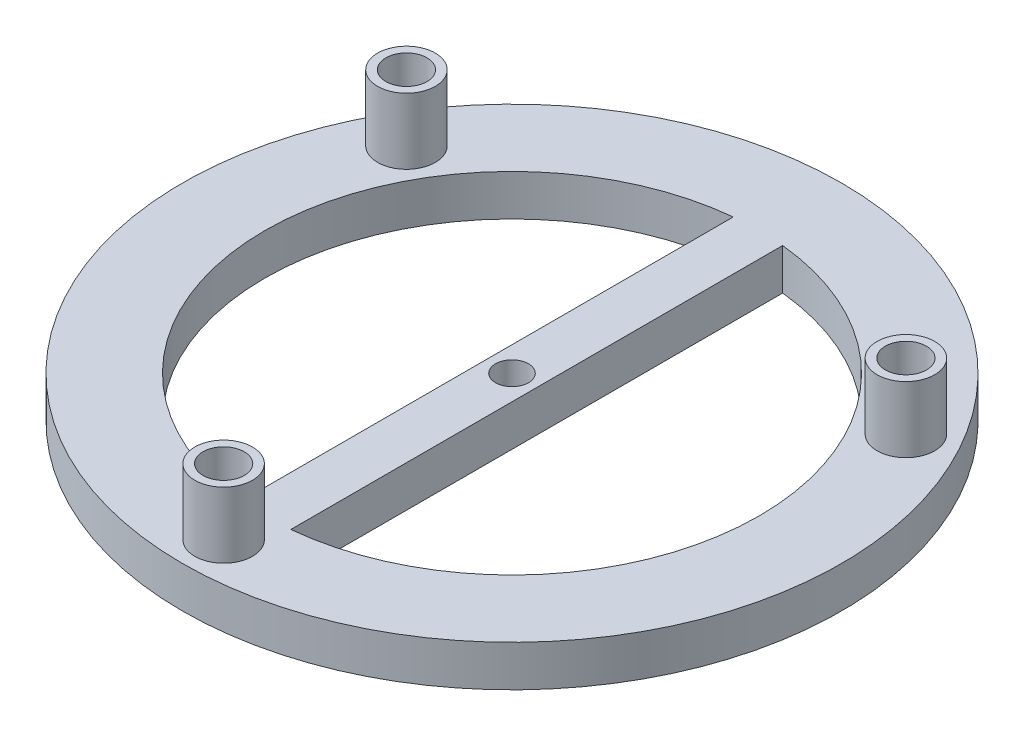
ISO-10303-21;
HEADER;
FILE_DESCRIPTION(('STEP AP214'),'2;1');
FILE_NAME('part.step','',(''),(''),'','','');
FILE_SCHEMA(('AUTOMOTIVE_DESIGN { 1 0 10303 214 1 1 1 1 }'));
ENDSEC;
DATA;
#1=APPLICATION_CONTEXT('core data for automotive mechanical design processes');
#2=APPLICATION_PROTOCOL_DEFINITION('international standard','automotive_design',2000,#1);
#3=PRODUCT_CONTEXT('',#1,'mechanical');
#4=PRODUCT('Part','Part','',(#3));
#5=PRODUCT_RELATED_PRODUCT_CATEGORY('part','',(#4));
#6=PRODUCT_DEFINITION_FORMATION('','',#4);
#7=PRODUCT_DEFINITION_CONTEXT('part definition',#1,'design');
#8=PRODUCT_DEFINITION('design','',#6,#7);
#9=PRODUCT_DEFINITION_SHAPE('','',#8);
#10=(LENGTH_UNIT() NAMED_UNIT(*) SI_UNIT(.MILLI.,.METRE.));
#11=(NAMED_UNIT(*) PLANE_ANGLE_UNIT() SI_UNIT($,.RADIAN.));
#12=(NAMED_UNIT(*) SI_UNIT($,.STERADIAN.) SOLID_ANGLE_UNIT());
#13=UNCERTAINTY_MEASURE_WITH_UNIT(LENGTH_MEASURE(1.E-05),#10,'distance_accuracy_value','');
#14=(GEOMETRIC_REPRESENTATION_CONTEXT(3) GLOBAL_UNCERTAINTY_ASSIGNED_CONTEXT((#13)) GLOBAL_UNIT_ASSIGNED_CONTEXT((#10,
#11,#12)) REPRESENTATION_CONTEXT('',''));
#15=CARTESIAN_POINT('',(0.,0.,0.));
#16=DIRECTION('',(0.,0.,1.));
#17=DIRECTION('',(1.,0.,0.));
#18=AXIS2_PLACEMENT_3D('',#15,#16,#17);
#19=CARTESIAN_POINT('',(0.,5.,0.));
#20=DIRECTION('',(0.,1.,0.));
#21=DIRECTION('',(0.,0.,1.));
#22=AXIS2_PLACEMENT_3D('',#19,#20,#21);
#23=PLANE('',#22);
#24=CARTESIAN_POINT('',(30.3108891324555,5.,-17.4999999999997));
#25=DIRECTION('',(0.,1.,0.));
#26=DIRECTION('',(0.866025403784443,0.,-0.499999999999992));
#27=AXIS2_PLACEMENT_3D('',#24,#25,#26);
#28=CIRCLE('',#27,3.5);
#29=CARTESIAN_POINT('',(33.3419780457011,5.,-19.2499999999997));
#30=VERTEX_POINT('',#29);
#31=EDGE_CURVE('E187',#30,#30,#28,.T.);
#32=ORIENTED_EDGE('',*,*,#31,.F.);
#33=EDGE_LOOP('',(#32));
#34=FACE_BOUND('',#33,.T.);
#35=CARTESIAN_POINT('',(-30.3108891324553,5.,-17.5000000000001));
#36=DIRECTION('',(0.,1.,0.));
#37=DIRECTION('',(-0.866025403784436,0.,-0.500000000000004));
#38=AXIS2_PLACEMENT_3D('',#35,#36,#37);
#39=CIRCLE('',#38,3.5);
#40=CARTESIAN_POINT('',(-33.3419780457008,5.,-19.2500000000002));
#41=VERTEX_POINT('',#40);
#42=EDGE_CURVE('E191',#41,#41,#39,.T.);
#43=ORIENTED_EDGE('',*,*,#42,.F.);
#44=EDGE_LOOP('',(#43));
#45=FACE_BOUND('',#44,.T.);
#46=CARTESIAN_POINT('',(0.,5.,35.));
#47=DIRECTION('',(0.,1.,0.));
#48=DIRECTION('',(0.,0.,1.));
#49=AXIS2_PLACEMENT_3D('',#46,#47,#48);
#50=CIRCLE('',#49,3.5);
#51=CARTESIAN_POINT('',(0.,5.,38.5));
#52=VERTEX_POINT('',#51);
#53=EDGE_CURVE('E195',#52,#52,#50,.T.);
#54=ORIENTED_EDGE('',*,*,#53,.F.);
#55=EDGE_LOOP('',(#54));
#56=FACE_BOUND('',#55,.T.);
#57=CARTESIAN_POINT('',(0.,5.,0.));
#58=DIRECTION('',(0.,1.,0.));
#59=DIRECTION('',(0.,0.,1.));
#60=AXIS2_PLACEMENT_3D('',#57,#58,#59);
#61=CIRCLE('',#60,2.);
#62=CARTESIAN_POINT('',(0.,5.,2.));
#63=VERTEX_POINT('',#62);
#64=EDGE_CURVE('E107',#63,#63,#61,.T.);
#65=ORIENTED_EDGE('',*,*,#64,.F.);
#66=EDGE_LOOP('',(#65));
#67=FACE_BOUND('',#66,.T.);
#68=DIRECTION('',(0.,0.,1.));
#69=VECTOR('',#68,1.);
#70=CARTESIAN_POINT('',(3.,5.,0.));
#71=LINE('',#70,#69);
#72=CARTESIAN_POINT('',(3.,5.,-29.8496231131986));
#73=VERTEX_POINT('',#72);
#74=CARTESIAN_POINT('',(3.,5.,29.8496231131986));
#75=VERTEX_POINT('',#74);
#76=EDGE_CURVE('E65',#73,#75,#71,.T.);
#77=ORIENTED_EDGE('',*,*,#76,.F.);
#78=CARTESIAN_POINT('',(0.,5.,0.));
#79=DIRECTION('',(0.,1.,0.));
#80=DIRECTION('',(0.,0.,1.));
#81=AXIS2_PLACEMENT_3D('',#78,#79,#80);
#82=CIRCLE('',#81,30.);
#83=EDGE_CURVE('E114',#75,#73,#82,.T.);
#84=ORIENTED_EDGE('',*,*,#83,.F.);
#85=EDGE_LOOP('',(#77,#84));
#86=FACE_BOUND('',#85,.T.);
#87=CARTESIAN_POINT('',(0.,5.,0.));
#88=DIRECTION('',(0.,1.,0.));
#89=DIRECTION('',(0.,0.,1.));
#90=AXIS2_PLACEMENT_3D('',#87,#88,#89);
#91=CIRCLE('',#90,40.);
#92=CARTESIAN_POINT('',(0.,5.,40.));
#93=VERTEX_POINT('',#92);
#94=EDGE_CURVE('E121',#93,#93,#91,.T.);
#95=ORIENTED_EDGE('',*,*,#94,.T.);
#96=EDGE_LOOP('',(#95));
#97=FACE_BOUND('',#96,.T.);
#98=CARTESIAN_POINT('',(0.,5.,0.));
#99=DIRECTION('',(0.,1.,0.));
#100=DIRECTION('',(0.,0.,1.));
#101=AXIS2_PLACEMENT_3D('',#98,#99,#100);
#102=CIRCLE('',#101,30.);
#103=CARTESIAN_POINT('',(-3.,5.,-29.8496231131986));
#104=VERTEX_POINT('',#103);
#105=CARTESIAN_POINT('',(-3.,5.,29.8496231131986));
#106=VERTEX_POINT('',#105);
#107=EDGE_CURVE('E95',#104,#106,#102,.T.);
#108=ORIENTED_EDGE('',*,*,#107,.F.);
#109=DIRECTION('',(0.,0.,1.));
#110=VECTOR('',#109,1.);
#111=CARTESIAN_POINT('',(-3.,5.,0.));
#112=LINE('',#111,#110);
#113=EDGE_CURVE('E57',#104,#106,#112,.T.);
#114=ORIENTED_EDGE('',*,*,#113,.T.);
#115=EDGE_LOOP('',(#108,#114));
#116=FACE_BOUND('',#115,.T.);
#117=ADVANCED_FACE('F41',(#34,#45,#56,#67,#86,#97,#116),#23,.T.);
#118=CARTESIAN_POINT('',(0.,0.,0.));
#119=DIRECTION('',(0.,1.,0.));
#120=DIRECTION('',(0.,0.,1.));
#121=AXIS2_PLACEMENT_3D('',#118,#119,#120);
#122=PLANE('',#121);
#123=CARTESIAN_POINT('',(0.,0.,0.));
#124=DIRECTION('',(0.,1.,0.));
#125=DIRECTION('',(0.,0.,1.));
#126=AXIS2_PLACEMENT_3D('',#123,#124,#125);
#127=CIRCLE('',#126,2.);
#128=CARTESIAN_POINT('',(0.,0.,2.));
#129=VERTEX_POINT('',#128);
#130=EDGE_CURVE('E115',#129,#129,#127,.T.);
#131=ORIENTED_EDGE('',*,*,#130,.T.);
#132=EDGE_LOOP('',(#131));
#133=FACE_BOUND('',#132,.T.);
#134=CARTESIAN_POINT('',(0.,0.,0.));
#135=DIRECTION('',(0.,1.,0.));
#136=DIRECTION('',(0.,0.,1.));
#137=AXIS2_PLACEMENT_3D('',#134,#135,#136);
#138=CIRCLE('',#137,40.);
#139=CARTESIAN_POINT('',(0.,0.,40.));
#140=VERTEX_POINT('',#139);
#141=EDGE_CURVE('E91',#140,#140,#138,.T.);
#142=ORIENTED_EDGE('',*,*,#141,.F.);
#143=EDGE_LOOP('',(#142));
#144=FACE_BOUND('',#143,.T.);
#145=CARTESIAN_POINT('',(0.,0.,0.));
#146=DIRECTION('',(0.,1.,0.));
#147=DIRECTION('',(0.,0.,1.));
#148=AXIS2_PLACEMENT_3D('',#145,#146,#147);
#149=CIRCLE('',#148,30.);
#150=CARTESIAN_POINT('',(3.,0.,29.8496231131986));
#151=VERTEX_POINT('',#150);
#152=CARTESIAN_POINT('',(3.,0.,-29.8496231131986));
#153=VERTEX_POINT('',#152);
#154=EDGE_CURVE('E125',#151,#153,#149,.T.);
#155=ORIENTED_EDGE('',*,*,#154,.T.);
#156=DIRECTION('',(0.,0.,1.));
#157=VECTOR('',#156,1.);
#158=CARTESIAN_POINT('',(3.,0.,0.));
#159=LINE('',#158,#157);
#160=EDGE_CURVE('E132',#153,#151,#159,.T.);
#161=ORIENTED_EDGE('',*,*,#160,.T.);
#162=EDGE_LOOP('',(#155,#161));
#163=FACE_BOUND('',#162,.T.);
#164=DIRECTION('',(0.,0.,1.));
#165=VECTOR('',#164,1.);
#166=CARTESIAN_POINT('',(-3.,0.,0.));
#167=LINE('',#166,#165);
#168=CARTESIAN_POINT('',(-3.,0.,-29.8496231131986));
#169=VERTEX_POINT('',#168);
#170=CARTESIAN_POINT('',(-3.,0.,29.8496231131986));
#171=VERTEX_POINT('',#170);
#172=EDGE_CURVE('E87',#169,#171,#167,.T.);
#173=ORIENTED_EDGE('',*,*,#172,.F.);
#174=CARTESIAN_POINT('',(0.,0.,0.));
#175=DIRECTION('',(0.,1.,0.));
#176=DIRECTION('',(0.,0.,1.));
#177=AXIS2_PLACEMENT_3D('',#174,#175,#176);
#178=CIRCLE('',#177,30.);
#179=EDGE_CURVE('E136',#169,#171,#178,.T.);
#180=ORIENTED_EDGE('',*,*,#179,.T.);
#181=EDGE_LOOP('',(#173,#180));
#182=FACE_BOUND('',#181,.T.);
#183=ADVANCED_FACE('F178',(#133,#144,#163,#182),#122,.F.);
#184=CARTESIAN_POINT('',(0.,5.,0.));
#185=DIRECTION('',(0.,-1.,0.));
#186=DIRECTION('',(0.,0.,-1.));
#187=AXIS2_PLACEMENT_3D('',#184,#185,#186);
#188=CYLINDRICAL_SURFACE('',#187,40.);
#189=ORIENTED_EDGE('',*,*,#94,.F.);
#190=EDGE_LOOP('',(#189));
#191=FACE_BOUND('',#190,.T.);
#192=ORIENTED_EDGE('',*,*,#141,.T.);
#193=EDGE_LOOP('',(#192));
#194=FACE_BOUND('',#193,.T.);
#195=ADVANCED_FACE('F43',(#191,#194),#188,.T.);
#196=CARTESIAN_POINT('',(3.,-5.,0.));
#197=DIRECTION('',(-1.,0.,0.));
#198=DIRECTION('',(0.,0.,1.));
#199=AXIS2_PLACEMENT_3D('',#196,#197,#198);
#200=PLANE('',#199);
#201=DIRECTION('',(0.,1.,0.));
#202=VECTOR('',#201,1.);
#203=CARTESIAN_POINT('',(3.,-5.,-29.8496231131986));
#204=LINE('',#203,#202);
#205=EDGE_CURVE('E101',#153,#73,#204,.T.);
#206=ORIENTED_EDGE('',*,*,#205,.T.);
#207=ORIENTED_EDGE('',*,*,#76,.T.);
#208=DIRECTION('',(0.,1.,0.));
#209=VECTOR('',#208,1.);
#210=CARTESIAN_POINT('',(3.,-5.,29.8496231131986));
#211=LINE('',#210,#209);
#212=EDGE_CURVE('E104',#151,#75,#211,.T.);
#213=ORIENTED_EDGE('',*,*,#212,.F.);
#214=ORIENTED_EDGE('',*,*,#160,.F.);
#215=EDGE_LOOP('',(#206,#207,#213,#214));
#216=FACE_BOUND('',#215,.T.);
#217=ADVANCED_FACE('F205',(#216),#200,.F.);
#218=CARTESIAN_POINT('',(0.,-5.,0.));
#219=DIRECTION('',(0.,1.,0.));
#220=DIRECTION('',(0.,0.,1.));
#221=AXIS2_PLACEMENT_3D('',#218,#219,#220);
#222=CYLINDRICAL_SURFACE('',#221,30.);
#223=ORIENTED_EDGE('',*,*,#212,.T.);
#224=ORIENTED_EDGE('',*,*,#83,.T.);
#225=ORIENTED_EDGE('',*,*,#205,.F.);
#226=ORIENTED_EDGE('',*,*,#154,.F.);
#227=EDGE_LOOP('',(#223,#224,#225,#226));
#228=FACE_BOUND('',#227,.T.);
#229=ADVANCED_FACE('F212',(#228),#222,.F.);
#230=CARTESIAN_POINT('',(-3.,-5.,0.));
#231=DIRECTION('',(-1.,0.,0.));
#232=DIRECTION('',(0.,0.,1.));
#233=AXIS2_PLACEMENT_3D('',#230,#231,#232);
#234=PLANE('',#233);
#235=ORIENTED_EDGE('',*,*,#172,.T.);
#236=DIRECTION('',(0.,1.,0.));
#237=VECTOR('',#236,1.);
#238=CARTESIAN_POINT('',(-3.,-5.,29.8496231131986));
#239=LINE('',#238,#237);
#240=EDGE_CURVE('E83',#171,#106,#239,.T.);
#241=ORIENTED_EDGE('',*,*,#240,.T.);
#242=ORIENTED_EDGE('',*,*,#113,.F.);
#243=DIRECTION('',(0.,1.,0.));
#244=VECTOR('',#243,1.);
#245=CARTESIAN_POINT('',(-3.,-5.,-29.8496231131986));
#246=LINE('',#245,#244);
#247=EDGE_CURVE('E92',#169,#104,#246,.T.);
#248=ORIENTED_EDGE('',*,*,#247,.F.);
#249=EDGE_LOOP('',(#235,#241,#242,#248));
#250=FACE_BOUND('',#249,.T.);
#251=ADVANCED_FACE('F85',(#250),#234,.T.);
#252=CARTESIAN_POINT('',(0.,-5.,0.));
#253=DIRECTION('',(0.,1.,0.));
#254=DIRECTION('',(0.,0.,1.));
#255=AXIS2_PLACEMENT_3D('',#252,#253,#254);
#256=CYLINDRICAL_SURFACE('',#255,30.);
#257=ORIENTED_EDGE('',*,*,#247,.T.);
#258=ORIENTED_EDGE('',*,*,#107,.T.);
#259=ORIENTED_EDGE('',*,*,#240,.F.);
#260=ORIENTED_EDGE('',*,*,#179,.F.);
#261=EDGE_LOOP('',(#257,#258,#259,#260));
#262=FACE_BOUND('',#261,.T.);
#263=ADVANCED_FACE('F96',(#262),#256,.F.);
#264=CARTESIAN_POINT('',(0.,-5.,0.));
#265=DIRECTION('',(0.,1.,0.));
#266=DIRECTION('',(0.,0.,1.));
#267=AXIS2_PLACEMENT_3D('',#264,#265,#266);
#268=CYLINDRICAL_SURFACE('',#267,2.);
#269=ORIENTED_EDGE('',*,*,#64,.T.);
#270=EDGE_LOOP('',(#269));
#271=FACE_BOUND('',#270,.T.);
#272=ORIENTED_EDGE('',*,*,#130,.F.);
#273=EDGE_LOOP('',(#272));
#274=FACE_BOUND('',#273,.T.);
#275=ADVANCED_FACE('F223',(#271,#274),#268,.F.);
#276=CARTESIAN_POINT('',(0.,13.,35.));
#277=DIRECTION('',(0.,1.,0.));
#278=DIRECTION('',(0.,0.,1.));
#279=AXIS2_PLACEMENT_3D('',#276,#277,#278);
#280=PLANE('',#279);
#281=CARTESIAN_POINT('',(0.,13.,35.));
#282=DIRECTION('',(0.,1.,0.));
#283=DIRECTION('',(0.,0.,1.));
#284=AXIS2_PLACEMENT_3D('',#281,#282,#283);
#285=CIRCLE('',#284,3.5);
#286=CARTESIAN_POINT('',(0.,13.,38.5));
#287=VERTEX_POINT('',#286);
#288=EDGE_CURVE('E280',#287,#287,#285,.T.);
#289=ORIENTED_EDGE('',*,*,#288,.T.);
#290=EDGE_LOOP('',(#289));
#291=FACE_BOUND('',#290,.T.);
#292=CARTESIAN_POINT('',(0.,13.,35.));
#293=DIRECTION('',(0.,1.,0.));
#294=DIRECTION('',(0.,0.,1.));
#295=AXIS2_PLACEMENT_3D('',#292,#293,#294);
#296=CIRCLE('',#295,2.5);
#297=CARTESIAN_POINT('',(0.,13.,37.5));
#298=VERTEX_POINT('',#297);
#299=EDGE_CURVE('E274',#298,#298,#296,.T.);
#300=ORIENTED_EDGE('',*,*,#299,.F.);
#301=EDGE_LOOP('',(#300));
#302=FACE_BOUND('',#301,.T.);
#303=ADVANCED_FACE('F226',(#291,#302),#280,.T.);
#304=CARTESIAN_POINT('',(0.,13.,35.));
#305=DIRECTION('',(0.,-1.,0.));
#306=DIRECTION('',(0.,0.,-1.));
#307=AXIS2_PLACEMENT_3D('',#304,#305,#306);
#308=CYLINDRICAL_SURFACE('',#307,3.5);
#309=ORIENTED_EDGE('',*,*,#288,.F.);
#310=EDGE_LOOP('',(#309));
#311=FACE_BOUND('',#310,.T.);
#312=ORIENTED_EDGE('',*,*,#53,.T.);
#313=EDGE_LOOP('',(#312));
#314=FACE_BOUND('',#313,.T.);
#315=ADVANCED_FACE('F228',(#311,#314),#308,.T.);
#316=CARTESIAN_POINT('',(0.,13.,35.));
#317=DIRECTION('',(0.,-1.,0.));
#318=DIRECTION('',(0.,0.,-1.));
#319=AXIS2_PLACEMENT_3D('',#316,#317,#318);
#320=CYLINDRICAL_SURFACE('',#319,2.5);
#321=ORIENTED_EDGE('',*,*,#299,.T.);
#322=EDGE_LOOP('',(#321));
#323=FACE_BOUND('',#322,.T.);
#324=CARTESIAN_POINT('',(0.,5.,35.));
#325=DIRECTION('',(0.,1.,0.));
#326=DIRECTION('',(0.,0.,1.));
#327=AXIS2_PLACEMENT_3D('',#324,#325,#326);
#328=CIRCLE('',#327,2.5);
#329=CARTESIAN_POINT('',(0.,5.,37.5));
#330=VERTEX_POINT('',#329);
#331=EDGE_CURVE('E141',#330,#330,#328,.F.);
#332=ORIENTED_EDGE('',*,*,#331,.T.);
#333=EDGE_LOOP('',(#332));
#334=FACE_BOUND('',#333,.T.);
#335=ADVANCED_FACE('F172',(#323,#334),#320,.F.);
#336=ORIENTED_EDGE('',*,*,#331,.F.);
#337=EDGE_LOOP('',(#336));
#338=FACE_BOUND('',#337,.T.);
#339=ADVANCED_FACE('F157',(#338),#23,.T.);
#340=CARTESIAN_POINT('',(-30.3108891324553,13.,-17.5000000000001));
#341=DIRECTION('',(0.,1.,0.));
#342=DIRECTION('',(-0.866025403784436,0.,-0.500000000000004));
#343=AXIS2_PLACEMENT_3D('',#340,#341,#342);
#344=PLANE('',#343);
#345=CARTESIAN_POINT('',(-30.3108891324553,13.,-17.5000000000001));
#346=DIRECTION('',(0.,1.,0.));
#347=DIRECTION('',(-0.866025403784436,0.,-0.500000000000004));
#348=AXIS2_PLACEMENT_3D('',#345,#346,#347);
#349=CIRCLE('',#348,3.5);
#350=CARTESIAN_POINT('',(-33.3419780457008,13.,-19.2500000000002));
#351=VERTEX_POINT('',#350);
#352=EDGE_CURVE('E270',#351,#351,#349,.T.);
#353=ORIENTED_EDGE('',*,*,#352,.T.);
#354=EDGE_LOOP('',(#353));
#355=FACE_BOUND('',#354,.T.);
#356=CARTESIAN_POINT('',(-30.3108891324553,13.,-17.5000000000001));
#357=DIRECTION('',(0.,1.,0.));
#358=DIRECTION('',(-0.866025403784436,0.,-0.500000000000004));
#359=AXIS2_PLACEMENT_3D('',#356,#357,#358);
#360=CIRCLE('',#359,2.5);
#361=CARTESIAN_POINT('',(-32.4759526419164,13.,-18.7500000000002));
#362=VERTEX_POINT('',#361);
#363=EDGE_CURVE('E265',#362,#362,#360,.T.);
#364=ORIENTED_EDGE('',*,*,#363,.F.);
#365=EDGE_LOOP('',(#364));
#366=FACE_BOUND('',#365,.T.);
#367=ADVANCED_FACE('F171',(#355,#366),#344,.T.);
#368=CARTESIAN_POINT('',(-30.3108891324553,13.,-17.5000000000001));
#369=DIRECTION('',(0.,-1.,0.));
#370=DIRECTION('',(0.,0.,-1.));
#371=AXIS2_PLACEMENT_3D('',#368,#369,#370);
#372=CYLINDRICAL_SURFACE('',#371,3.5);
#373=ORIENTED_EDGE('',*,*,#352,.F.);
#374=EDGE_LOOP('',(#373));
#375=FACE_BOUND('',#374,.T.);
#376=ORIENTED_EDGE('',*,*,#42,.T.);
#377=EDGE_LOOP('',(#376));
#378=FACE_BOUND('',#377,.T.);
#379=ADVANCED_FACE('F166',(#375,#378),#372,.T.);
#380=CARTESIAN_POINT('',(-30.3108891324553,13.,-17.5000000000001));
#381=DIRECTION('',(0.,-1.,0.));
#382=DIRECTION('',(0.,0.,-1.));
#383=AXIS2_PLACEMENT_3D('',#380,#381,#382);
#384=CYLINDRICAL_SURFACE('',#383,2.5);
#385=ORIENTED_EDGE('',*,*,#363,.T.);
#386=EDGE_LOOP('',(#385));
#387=FACE_BOUND('',#386,.T.);
#388=CARTESIAN_POINT('',(-30.3108891324553,5.,-17.5000000000001));
#389=DIRECTION('',(0.,1.,0.));
#390=DIRECTION('',(0.,0.,1.));
#391=AXIS2_PLACEMENT_3D('',#388,#389,#390);
#392=CIRCLE('',#391,2.5);
#393=CARTESIAN_POINT('',(-30.3108891324553,5.,-15.0000000000001));
#394=VERTEX_POINT('',#393);
#395=EDGE_CURVE('E50',#394,#394,#392,.F.);
#396=ORIENTED_EDGE('',*,*,#395,.T.);
#397=EDGE_LOOP('',(#396));
#398=FACE_BOUND('',#397,.T.);
#399=ADVANCED_FACE('F151',(#387,#398),#384,.F.);
#400=ORIENTED_EDGE('',*,*,#395,.F.);
#401=EDGE_LOOP('',(#400));
#402=FACE_BOUND('',#401,.T.);
#403=ADVANCED_FACE('F153',(#402),#23,.T.);
#404=CARTESIAN_POINT('',(30.3108891324555,13.,-17.4999999999997));
#405=DIRECTION('',(0.,1.,0.));
#406=DIRECTION('',(0.866025403784443,0.,-0.499999999999992));
#407=AXIS2_PLACEMENT_3D('',#404,#405,#406);
#408=PLANE('',#407);
#409=CARTESIAN_POINT('',(30.3108891324555,13.,-17.4999999999997));
#410=DIRECTION('',(0.,1.,0.));
#411=DIRECTION('',(0.866025403784443,0.,-0.499999999999992));
#412=AXIS2_PLACEMENT_3D('',#409,#410,#411);
#413=CIRCLE('',#412,3.5);
#414=CARTESIAN_POINT('',(33.3419780457011,13.,-19.2499999999997));
#415=VERTEX_POINT('',#414);
#416=EDGE_CURVE('E260',#415,#415,#413,.T.);
#417=ORIENTED_EDGE('',*,*,#416,.T.);
#418=EDGE_LOOP('',(#417));
#419=FACE_BOUND('',#418,.T.);
#420=CARTESIAN_POINT('',(30.3108891324555,13.,-17.4999999999997));
#421=DIRECTION('',(0.,1.,0.));
#422=DIRECTION('',(0.866025403784443,0.,-0.499999999999992));
#423=AXIS2_PLACEMENT_3D('',#420,#421,#422);
#424=CIRCLE('',#423,2.5);
#425=CARTESIAN_POINT('',(32.4759526419166,13.,-18.7499999999997));
#426=VERTEX_POINT('',#425);
#427=EDGE_CURVE('E254',#426,#426,#424,.T.);
#428=ORIENTED_EDGE('',*,*,#427,.F.);
#429=EDGE_LOOP('',(#428));
#430=FACE_BOUND('',#429,.T.);
#431=ADVANCED_FACE('F155',(#419,#430),#408,.T.);
#432=CARTESIAN_POINT('',(30.3108891324555,13.,-17.4999999999997));
#433=DIRECTION('',(0.,-1.,0.));
#434=DIRECTION('',(0.,0.,-1.));
#435=AXIS2_PLACEMENT_3D('',#432,#433,#434);
#436=CYLINDRICAL_SURFACE('',#435,3.5);
#437=ORIENTED_EDGE('',*,*,#416,.F.);
#438=EDGE_LOOP('',(#437));
#439=FACE_BOUND('',#438,.T.);
#440=ORIENTED_EDGE('',*,*,#31,.T.);
#441=EDGE_LOOP('',(#440));
#442=FACE_BOUND('',#441,.T.);
#443=ADVANCED_FACE('F163',(#439,#442),#436,.T.);
#444=CARTESIAN_POINT('',(30.3108891324555,13.,-17.4999999999997));
#445=DIRECTION('',(0.,-1.,0.));
#446=DIRECTION('',(0.,0.,-1.));
#447=AXIS2_PLACEMENT_3D('',#444,#445,#446);
#448=CYLINDRICAL_SURFACE('',#447,2.5);
#449=ORIENTED_EDGE('',*,*,#427,.T.);
#450=EDGE_LOOP('',(#449));
#451=FACE_BOUND('',#450,.T.);
#452=CARTESIAN_POINT('',(30.3108891324555,5.,-17.4999999999997));
#453=DIRECTION('',(0.,1.,0.));
#454=DIRECTION('',(0.,0.,1.));
#455=AXIS2_PLACEMENT_3D('',#452,#453,#454);
#456=CIRCLE('',#455,2.5);
#457=CARTESIAN_POINT('',(30.3108891324555,5.,-14.9999999999997));
#458=VERTEX_POINT('',#457);
#459=EDGE_CURVE('E11',#458,#458,#456,.F.);
#460=ORIENTED_EDGE('',*,*,#459,.T.);
#461=EDGE_LOOP('',(#460));
#462=FACE_BOUND('',#461,.T.);
#463=ADVANCED_FACE('F175',(#451,#462),#448,.F.);
#464=ORIENTED_EDGE('',*,*,#459,.F.);
#465=EDGE_LOOP('',(#464));
#466=FACE_BOUND('',#465,.T.);
#467=ADVANCED_FACE('F158',(#466),#23,.T.);
#468=CLOSED_SHELL('',(#117,#183,#195,#217,#229,#251,#263,#275,#303,#315,#335,#339,#367,#379,
#399,#403,#431,#443,#463,#467));
#469=MANIFOLD_SOLID_BREP('B2',#468);
#470=ADVANCED_BREP_SHAPE_REPRESENTATION('',(#18,#469),#14);
#471=SHAPE_DEFINITION_REPRESENTATION(#9,#470);
ENDSEC;
END-ISO-10303-21;
